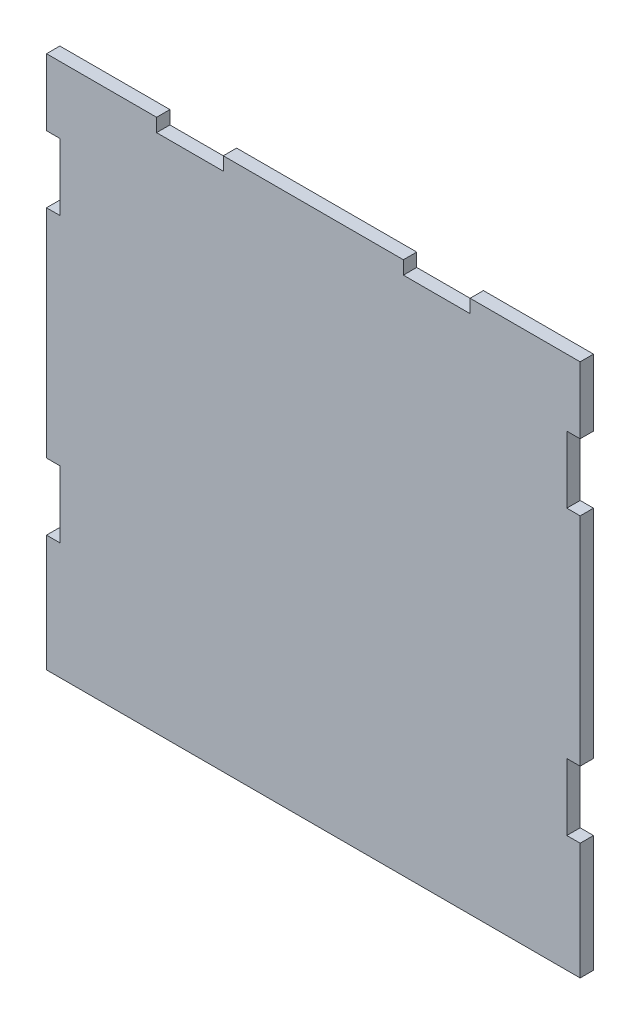
ISO-10303-21;
HEADER;
FILE_DESCRIPTION(('STEP AP214'),'2;1');
FILE_NAME('part.step','',(''),(''),'','','');
FILE_SCHEMA(('AUTOMOTIVE_DESIGN { 1 0 10303 214 1 1 1 1 }'));
ENDSEC;
DATA;
#1=APPLICATION_CONTEXT('core data for automotive mechanical design processes');
#2=APPLICATION_PROTOCOL_DEFINITION('international standard','automotive_design',2000,#1);
#3=PRODUCT_CONTEXT('',#1,'mechanical');
#4=PRODUCT('Part','Part','',(#3));
#5=PRODUCT_RELATED_PRODUCT_CATEGORY('part','',(#4));
#6=PRODUCT_DEFINITION_FORMATION('','',#4);
#7=PRODUCT_DEFINITION_CONTEXT('part definition',#1,'design');
#8=PRODUCT_DEFINITION('design','',#6,#7);
#9=PRODUCT_DEFINITION_SHAPE('','',#8);
#10=(LENGTH_UNIT() NAMED_UNIT(*) SI_UNIT(.MILLI.,.METRE.));
#11=(NAMED_UNIT(*) PLANE_ANGLE_UNIT() SI_UNIT($,.RADIAN.));
#12=(NAMED_UNIT(*) SI_UNIT($,.STERADIAN.) SOLID_ANGLE_UNIT());
#13=UNCERTAINTY_MEASURE_WITH_UNIT(LENGTH_MEASURE(1.E-05),#10,'distance_accuracy_value','');
#14=(GEOMETRIC_REPRESENTATION_CONTEXT(3) GLOBAL_UNCERTAINTY_ASSIGNED_CONTEXT((#13)) GLOBAL_UNIT_ASSIGNED_CONTEXT((#10,
#11,#12)) REPRESENTATION_CONTEXT('',''));
#15=CARTESIAN_POINT('',(0.,0.,0.));
#16=DIRECTION('',(0.,0.,1.));
#17=DIRECTION('',(1.,0.,0.));
#18=AXIS2_PLACEMENT_3D('',#15,#16,#17);
#19=CARTESIAN_POINT('',(101.6,0.,5.08));
#20=DIRECTION('',(1.,0.,0.));
#21=DIRECTION('',(0.,1.,0.));
#22=AXIS2_PLACEMENT_3D('',#19,#20,#21);
#23=PLANE('',#22);
#24=DIRECTION('',(0.,-1.,0.));
#25=VECTOR('',#24,1.);
#26=CARTESIAN_POINT('',(101.6,0.,5.08));
#27=LINE('',#26,#25);
#28=CARTESIAN_POINT('',(101.6,101.6,5.08));
#29=VERTEX_POINT('',#28);
#30=CARTESIAN_POINT('',(101.6,76.2,5.08));
#31=VERTEX_POINT('',#30);
#32=EDGE_CURVE('E379',#29,#31,#27,.T.);
#33=ORIENTED_EDGE('',*,*,#32,.T.);
#34=DIRECTION('',(0.,0.,-1.));
#35=VECTOR('',#34,1.);
#36=CARTESIAN_POINT('',(101.6,76.2,5.08));
#37=LINE('',#36,#35);
#38=CARTESIAN_POINT('',(101.6,76.2,0.));
#39=VERTEX_POINT('',#38);
#40=EDGE_CURVE('E349',#31,#39,#37,.T.);
#41=ORIENTED_EDGE('',*,*,#40,.T.);
#42=DIRECTION('',(0.,-1.,0.));
#43=VECTOR('',#42,1.);
#44=CARTESIAN_POINT('',(101.6,0.,0.));
#45=LINE('',#44,#43);
#46=CARTESIAN_POINT('',(101.6,101.6,0.));
#47=VERTEX_POINT('',#46);
#48=EDGE_CURVE('E398',#47,#39,#45,.T.);
#49=ORIENTED_EDGE('',*,*,#48,.F.);
#50=DIRECTION('',(0.,0.,-1.));
#51=VECTOR('',#50,1.);
#52=CARTESIAN_POINT('',(101.6,101.6,5.08));
#53=LINE('',#52,#51);
#54=EDGE_CURVE('E11',#29,#47,#53,.T.);
#55=ORIENTED_EDGE('',*,*,#54,.F.);
#56=EDGE_LOOP('',(#33,#41,#49,#55));
#57=FACE_BOUND('',#56,.T.);
#58=ADVANCED_FACE('F33',(#57),#23,.T.);
#59=DIRECTION('',(0.,0.,-1.));
#60=VECTOR('',#59,1.);
#61=CARTESIAN_POINT('',(101.6,50.8,5.08));
#62=LINE('',#61,#60);
#63=CARTESIAN_POINT('',(101.6,50.8,5.08));
#64=VERTEX_POINT('',#63);
#65=CARTESIAN_POINT('',(101.6,50.8,0.));
#66=VERTEX_POINT('',#65);
#67=EDGE_CURVE('E347',#64,#66,#62,.T.);
#68=ORIENTED_EDGE('',*,*,#67,.F.);
#69=CARTESIAN_POINT('',(101.6,-31.75,5.08));
#70=VERTEX_POINT('',#69);
#71=EDGE_CURVE('E383',#64,#70,#27,.T.);
#72=ORIENTED_EDGE('',*,*,#71,.T.);
#73=DIRECTION('',(0.,0.,-1.));
#74=VECTOR('',#73,1.);
#75=CARTESIAN_POINT('',(101.6,-31.75,5.08));
#76=LINE('',#75,#74);
#77=CARTESIAN_POINT('',(101.6,-31.75,0.));
#78=VERTEX_POINT('',#77);
#79=EDGE_CURVE('E374',#70,#78,#76,.T.);
#80=ORIENTED_EDGE('',*,*,#79,.T.);
#81=EDGE_CURVE('E402',#66,#78,#45,.T.);
#82=ORIENTED_EDGE('',*,*,#81,.F.);
#83=EDGE_LOOP('',(#68,#72,#80,#82));
#84=FACE_BOUND('',#83,.T.);
#85=ADVANCED_FACE('F474',(#84),#23,.T.);
#86=CARTESIAN_POINT('',(0.,101.6,5.08));
#87=DIRECTION('',(0.,1.,0.));
#88=DIRECTION('',(0.,0.,1.));
#89=AXIS2_PLACEMENT_3D('',#86,#87,#88);
#90=PLANE('',#89);
#91=DIRECTION('',(1.,0.,0.));
#92=VECTOR('',#91,1.);
#93=CARTESIAN_POINT('',(0.,101.6,5.08));
#94=LINE('',#93,#92);
#95=CARTESIAN_POINT('',(-34.29,101.6,5.08));
#96=VERTEX_POINT('',#95);
#97=CARTESIAN_POINT('',(34.29,101.6,5.08));
#98=VERTEX_POINT('',#97);
#99=EDGE_CURVE('E389',#96,#98,#94,.T.);
#100=ORIENTED_EDGE('',*,*,#99,.T.);
#101=DIRECTION('',(0.,0.,-1.));
#102=VECTOR('',#101,1.);
#103=CARTESIAN_POINT('',(34.29,101.6,5.08));
#104=LINE('',#103,#102);
#105=CARTESIAN_POINT('',(34.29,101.6,0.));
#106=VERTEX_POINT('',#105);
#107=EDGE_CURVE('E295',#98,#106,#104,.T.);
#108=ORIENTED_EDGE('',*,*,#107,.T.);
#109=DIRECTION('',(1.,0.,0.));
#110=VECTOR('',#109,1.);
#111=CARTESIAN_POINT('',(0.,101.6,0.));
#112=LINE('',#111,#110);
#113=CARTESIAN_POINT('',(-34.29,101.6,0.));
#114=VERTEX_POINT('',#113);
#115=EDGE_CURVE('E407',#114,#106,#112,.T.);
#116=ORIENTED_EDGE('',*,*,#115,.F.);
#117=DIRECTION('',(0.,0.,-1.));
#118=VECTOR('',#117,1.);
#119=CARTESIAN_POINT('',(-34.29,101.6,5.08));
#120=LINE('',#119,#118);
#121=EDGE_CURVE('E290',#96,#114,#120,.T.);
#122=ORIENTED_EDGE('',*,*,#121,.F.);
#123=EDGE_LOOP('',(#100,#108,#116,#122));
#124=FACE_BOUND('',#123,.T.);
#125=ADVANCED_FACE('F449',(#124),#90,.T.);
#126=CARTESIAN_POINT('',(-101.6,101.6,5.08));
#127=VERTEX_POINT('',#126);
#128=CARTESIAN_POINT('',(-59.69,101.6,5.08));
#129=VERTEX_POINT('',#128);
#130=EDGE_CURVE('E385',#127,#129,#94,.T.);
#131=ORIENTED_EDGE('',*,*,#130,.T.);
#132=DIRECTION('',(0.,0.,-1.));
#133=VECTOR('',#132,1.);
#134=CARTESIAN_POINT('',(-59.69,101.6,5.08));
#135=LINE('',#134,#133);
#136=CARTESIAN_POINT('',(-59.69,101.6,0.));
#137=VERTEX_POINT('',#136);
#138=EDGE_CURVE('E270',#129,#137,#135,.T.);
#139=ORIENTED_EDGE('',*,*,#138,.T.);
#140=CARTESIAN_POINT('',(-101.6,101.6,0.));
#141=VERTEX_POINT('',#140);
#142=EDGE_CURVE('E403',#141,#137,#112,.T.);
#143=ORIENTED_EDGE('',*,*,#142,.F.);
#144=DIRECTION('',(0.,0.,-1.));
#145=VECTOR('',#144,1.);
#146=CARTESIAN_POINT('',(-101.6,101.6,5.08));
#147=LINE('',#146,#145);
#148=EDGE_CURVE('E41',#127,#141,#147,.T.);
#149=ORIENTED_EDGE('',*,*,#148,.F.);
#150=EDGE_LOOP('',(#131,#139,#143,#149));
#151=FACE_BOUND('',#150,.T.);
#152=ADVANCED_FACE('F430',(#151),#90,.T.);
#153=CARTESIAN_POINT('',(-101.6,0.,5.08));
#154=DIRECTION('',(1.,0.,0.));
#155=DIRECTION('',(0.,1.,0.));
#156=AXIS2_PLACEMENT_3D('',#153,#154,#155);
#157=PLANE('',#156);
#158=DIRECTION('',(0.,0.,-1.));
#159=VECTOR('',#158,1.);
#160=CARTESIAN_POINT('',(-101.6,50.8,5.08));
#161=LINE('',#160,#159);
#162=CARTESIAN_POINT('',(-101.6,50.8,5.08));
#163=VERTEX_POINT('',#162);
#164=CARTESIAN_POINT('',(-101.6,50.8,0.));
#165=VERTEX_POINT('',#164);
#166=EDGE_CURVE('E278',#163,#165,#161,.T.);
#167=ORIENTED_EDGE('',*,*,#166,.T.);
#168=DIRECTION('',(0.,-1.,0.));
#169=VECTOR('',#168,1.);
#170=CARTESIAN_POINT('',(-101.6,0.,0.));
#171=LINE('',#170,#169);
#172=CARTESIAN_POINT('',(-101.6,-31.75,0.));
#173=VERTEX_POINT('',#172);
#174=EDGE_CURVE('E412',#165,#173,#171,.T.);
#175=ORIENTED_EDGE('',*,*,#174,.T.);
#176=DIRECTION('',(0.,0.,-1.));
#177=VECTOR('',#176,1.);
#178=CARTESIAN_POINT('',(-101.6,-31.75,5.08));
#179=LINE('',#178,#177);
#180=CARTESIAN_POINT('',(-101.6,-31.75,5.08));
#181=VERTEX_POINT('',#180);
#182=EDGE_CURVE('E256',#181,#173,#179,.T.);
#183=ORIENTED_EDGE('',*,*,#182,.F.);
#184=DIRECTION('',(0.,-1.,0.));
#185=VECTOR('',#184,1.);
#186=CARTESIAN_POINT('',(-101.6,0.,5.08));
#187=LINE('',#186,#185);
#188=EDGE_CURVE('E394',#163,#181,#187,.T.);
#189=ORIENTED_EDGE('',*,*,#188,.F.);
#190=EDGE_LOOP('',(#167,#175,#183,#189));
#191=FACE_BOUND('',#190,.T.);
#192=ADVANCED_FACE('F494',(#191),#157,.F.);
#193=DIRECTION('',(0.,0.,-1.));
#194=VECTOR('',#193,1.);
#195=CARTESIAN_POINT('',(-101.6,-57.15,5.08));
#196=LINE('',#195,#194);
#197=CARTESIAN_POINT('',(-101.6,-57.15,5.08));
#198=VERTEX_POINT('',#197);
#199=CARTESIAN_POINT('',(-101.6,-57.15,0.));
#200=VERTEX_POINT('',#199);
#201=EDGE_CURVE('E226',#198,#200,#196,.T.);
#202=ORIENTED_EDGE('',*,*,#201,.T.);
#203=CARTESIAN_POINT('',(-101.6,-101.6,0.));
#204=VERTEX_POINT('',#203);
#205=EDGE_CURVE('E406',#200,#204,#171,.T.);
#206=ORIENTED_EDGE('',*,*,#205,.T.);
#207=DIRECTION('',(0.,0.,-1.));
#208=VECTOR('',#207,1.);
#209=CARTESIAN_POINT('',(-101.6,-101.6,5.08));
#210=LINE('',#209,#208);
#211=CARTESIAN_POINT('',(-101.6,-101.6,5.08));
#212=VERTEX_POINT('',#211);
#213=EDGE_CURVE('E417',#212,#204,#210,.T.);
#214=ORIENTED_EDGE('',*,*,#213,.F.);
#215=EDGE_CURVE('E388',#198,#212,#187,.T.);
#216=ORIENTED_EDGE('',*,*,#215,.F.);
#217=EDGE_LOOP('',(#202,#206,#214,#216));
#218=FACE_BOUND('',#217,.T.);
#219=ADVANCED_FACE('F489',(#218),#157,.F.);
#220=CARTESIAN_POINT('',(0.,0.,5.08));
#221=DIRECTION('',(0.,0.,1.));
#222=DIRECTION('',(1.,0.,0.));
#223=AXIS2_PLACEMENT_3D('',#220,#221,#222);
#224=PLANE('',#223);
#225=DIRECTION('',(-1.,0.,0.));
#226=VECTOR('',#225,1.);
#227=CARTESIAN_POINT('',(0.,50.8,5.08));
#228=LINE('',#227,#226);
#229=CARTESIAN_POINT('',(96.52,50.8,5.08));
#230=VERTEX_POINT('',#229);
#231=EDGE_CURVE('E337',#64,#230,#228,.T.);
#232=ORIENTED_EDGE('',*,*,#231,.T.);
#233=DIRECTION('',(0.,-1.,0.));
#234=VECTOR('',#233,1.);
#235=CARTESIAN_POINT('',(96.52,0.,5.08));
#236=LINE('',#235,#234);
#237=CARTESIAN_POINT('',(96.52,76.2,5.08));
#238=VERTEX_POINT('',#237);
#239=EDGE_CURVE('E332',#238,#230,#236,.T.);
#240=ORIENTED_EDGE('',*,*,#239,.F.);
#241=DIRECTION('',(-1.,0.,0.));
#242=VECTOR('',#241,1.);
#243=CARTESIAN_POINT('',(0.,76.2,5.08));
#244=LINE('',#243,#242);
#245=EDGE_CURVE('E334',#31,#238,#244,.T.);
#246=ORIENTED_EDGE('',*,*,#245,.F.);
#247=ORIENTED_EDGE('',*,*,#32,.F.);
#248=CARTESIAN_POINT('',(59.69,101.6,5.08));
#249=VERTEX_POINT('',#248);
#250=EDGE_CURVE('E382',#249,#29,#94,.T.);
#251=ORIENTED_EDGE('',*,*,#250,.F.);
#252=DIRECTION('',(0.,-1.,0.));
#253=VECTOR('',#252,1.);
#254=CARTESIAN_POINT('',(59.69,0.,5.08));
#255=LINE('',#254,#253);
#256=CARTESIAN_POINT('',(59.69,96.52,5.08));
#257=VERTEX_POINT('',#256);
#258=EDGE_CURVE('E307',#249,#257,#255,.T.);
#259=ORIENTED_EDGE('',*,*,#258,.T.);
#260=DIRECTION('',(1.,0.,0.));
#261=VECTOR('',#260,1.);
#262=CARTESIAN_POINT('',(0.,96.52,5.08));
#263=LINE('',#262,#261);
#264=CARTESIAN_POINT('',(34.29,96.52,5.08));
#265=VERTEX_POINT('',#264);
#266=EDGE_CURVE('E310',#265,#257,#263,.T.);
#267=ORIENTED_EDGE('',*,*,#266,.F.);
#268=DIRECTION('',(0.,-1.,0.));
#269=VECTOR('',#268,1.);
#270=CARTESIAN_POINT('',(34.2899999999997,0.,5.08));
#271=LINE('',#270,#269);
#272=EDGE_CURVE('E313',#98,#265,#271,.T.);
#273=ORIENTED_EDGE('',*,*,#272,.F.);
#274=ORIENTED_EDGE('',*,*,#99,.F.);
#275=DIRECTION('',(0.,-1.,0.));
#276=VECTOR('',#275,1.);
#277=CARTESIAN_POINT('',(-34.29,0.,5.08));
#278=LINE('',#277,#276);
#279=CARTESIAN_POINT('',(-34.29,96.52,5.08));
#280=VERTEX_POINT('',#279);
#281=EDGE_CURVE('E282',#96,#280,#278,.T.);
#282=ORIENTED_EDGE('',*,*,#281,.T.);
#283=DIRECTION('',(1.,0.,0.));
#284=VECTOR('',#283,1.);
#285=CARTESIAN_POINT('',(0.,96.52,5.08));
#286=LINE('',#285,#284);
#287=CARTESIAN_POINT('',(-59.69,96.52,5.08));
#288=VERTEX_POINT('',#287);
#289=EDGE_CURVE('E285',#288,#280,#286,.T.);
#290=ORIENTED_EDGE('',*,*,#289,.F.);
#291=DIRECTION('',(0.,-1.,0.));
#292=VECTOR('',#291,1.);
#293=CARTESIAN_POINT('',(-59.69,0.,5.08));
#294=LINE('',#293,#292);
#295=EDGE_CURVE('E288',#129,#288,#294,.T.);
#296=ORIENTED_EDGE('',*,*,#295,.F.);
#297=ORIENTED_EDGE('',*,*,#130,.F.);
#298=CARTESIAN_POINT('',(-101.6,76.2,5.08));
#299=VERTEX_POINT('',#298);
#300=EDGE_CURVE('E390',#127,#299,#187,.T.);
#301=ORIENTED_EDGE('',*,*,#300,.T.);
#302=DIRECTION('',(1.,0.,0.));
#303=VECTOR('',#302,1.);
#304=CARTESIAN_POINT('',(0.,76.2,5.08));
#305=LINE('',#304,#303);
#306=CARTESIAN_POINT('',(-96.52,76.2,5.08));
#307=VERTEX_POINT('',#306);
#308=EDGE_CURVE('E264',#299,#307,#305,.T.);
#309=ORIENTED_EDGE('',*,*,#308,.T.);
#310=DIRECTION('',(0.,1.,0.));
#311=VECTOR('',#310,1.);
#312=CARTESIAN_POINT('',(-96.52,0.,5.08));
#313=LINE('',#312,#311);
#314=CARTESIAN_POINT('',(-96.52,50.8,5.08));
#315=VERTEX_POINT('',#314);
#316=EDGE_CURVE('E259',#315,#307,#313,.T.);
#317=ORIENTED_EDGE('',*,*,#316,.F.);
#318=DIRECTION('',(1.,0.,0.));
#319=VECTOR('',#318,1.);
#320=CARTESIAN_POINT('',(0.,50.8,5.08));
#321=LINE('',#320,#319);
#322=EDGE_CURVE('E261',#163,#315,#321,.T.);
#323=ORIENTED_EDGE('',*,*,#322,.F.);
#324=ORIENTED_EDGE('',*,*,#188,.T.);
#325=DIRECTION('',(1.,0.,0.));
#326=VECTOR('',#325,1.);
#327=CARTESIAN_POINT('',(0.,-31.75,5.08));
#328=LINE('',#327,#326);
#329=CARTESIAN_POINT('',(-96.52,-31.75,5.08));
#330=VERTEX_POINT('',#329);
#331=EDGE_CURVE('E230',#181,#330,#328,.T.);
#332=ORIENTED_EDGE('',*,*,#331,.T.);
#333=DIRECTION('',(0.,1.,0.));
#334=VECTOR('',#333,1.);
#335=CARTESIAN_POINT('',(-96.52,0.,5.08));
#336=LINE('',#335,#334);
#337=CARTESIAN_POINT('',(-96.52,-57.15,5.08));
#338=VERTEX_POINT('',#337);
#339=EDGE_CURVE('E231',#338,#330,#336,.T.);
#340=ORIENTED_EDGE('',*,*,#339,.F.);
#341=DIRECTION('',(1.,0.,0.));
#342=VECTOR('',#341,1.);
#343=CARTESIAN_POINT('',(0.,-57.1500000000001,5.08));
#344=LINE('',#343,#342);
#345=EDGE_CURVE('E220',#198,#338,#344,.T.);
#346=ORIENTED_EDGE('',*,*,#345,.F.);
#347=ORIENTED_EDGE('',*,*,#215,.T.);
#348=DIRECTION('',(1.,0.,0.));
#349=VECTOR('',#348,1.);
#350=CARTESIAN_POINT('',(0.,-101.6,5.08));
#351=LINE('',#350,#349);
#352=CARTESIAN_POINT('',(101.6,-101.6,5.08));
#353=VERTEX_POINT('',#352);
#354=EDGE_CURVE('E393',#212,#353,#351,.T.);
#355=ORIENTED_EDGE('',*,*,#354,.T.);
#356=CARTESIAN_POINT('',(101.6,-57.15,5.08));
#357=VERTEX_POINT('',#356);
#358=EDGE_CURVE('E384',#357,#353,#27,.T.);
#359=ORIENTED_EDGE('',*,*,#358,.F.);
#360=DIRECTION('',(-1.,0.,0.));
#361=VECTOR('',#360,1.);
#362=CARTESIAN_POINT('',(0.,-57.15,5.08));
#363=LINE('',#362,#361);
#364=CARTESIAN_POINT('',(96.52,-57.15,5.08));
#365=VERTEX_POINT('',#364);
#366=EDGE_CURVE('E358',#357,#365,#363,.T.);
#367=ORIENTED_EDGE('',*,*,#366,.T.);
#368=DIRECTION('',(0.,-1.,0.));
#369=VECTOR('',#368,1.);
#370=CARTESIAN_POINT('',(96.52,0.,5.08));
#371=LINE('',#370,#369);
#372=CARTESIAN_POINT('',(96.52,-31.75,5.08));
#373=VERTEX_POINT('',#372);
#374=EDGE_CURVE('E353',#373,#365,#371,.T.);
#375=ORIENTED_EDGE('',*,*,#374,.F.);
#376=DIRECTION('',(-1.,0.,0.));
#377=VECTOR('',#376,1.);
#378=CARTESIAN_POINT('',(0.,-31.75,5.08));
#379=LINE('',#378,#377);
#380=EDGE_CURVE('E355',#70,#373,#379,.T.);
#381=ORIENTED_EDGE('',*,*,#380,.F.);
#382=ORIENTED_EDGE('',*,*,#71,.F.);
#383=EDGE_LOOP('',(#232,#240,#246,#247,#251,#259,#267,#273,#274,#282,#290,#296,#297,#301,#309,
#317,#323,#324,#332,#340,#346,#347,#355,#359,#367,#375,#381,#382));
#384=FACE_BOUND('',#383,.T.);
#385=ADVANCED_FACE('F241',(#384),#224,.T.);
#386=CARTESIAN_POINT('',(0.,0.,0.));
#387=DIRECTION('',(0.,0.,1.));
#388=DIRECTION('',(1.,0.,0.));
#389=AXIS2_PLACEMENT_3D('',#386,#387,#388);
#390=PLANE('',#389);
#391=DIRECTION('',(0.,-1.,0.));
#392=VECTOR('',#391,1.);
#393=CARTESIAN_POINT('',(96.52,0.,0.));
#394=LINE('',#393,#392);
#395=CARTESIAN_POINT('',(96.52,76.2,0.));
#396=VERTEX_POINT('',#395);
#397=CARTESIAN_POINT('',(96.52,50.8,0.));
#398=VERTEX_POINT('',#397);
#399=EDGE_CURVE('E48',#396,#398,#394,.T.);
#400=ORIENTED_EDGE('',*,*,#399,.T.);
#401=DIRECTION('',(-1.,0.,0.));
#402=VECTOR('',#401,1.);
#403=CARTESIAN_POINT('',(0.,50.8,0.));
#404=LINE('',#403,#402);
#405=EDGE_CURVE('E335',#66,#398,#404,.T.);
#406=ORIENTED_EDGE('',*,*,#405,.F.);
#407=ORIENTED_EDGE('',*,*,#81,.T.);
#408=DIRECTION('',(-1.,0.,0.));
#409=VECTOR('',#408,1.);
#410=CARTESIAN_POINT('',(0.,-31.75,0.));
#411=LINE('',#410,#409);
#412=CARTESIAN_POINT('',(96.52,-31.75,0.));
#413=VERTEX_POINT('',#412);
#414=EDGE_CURVE('E364',#78,#413,#411,.T.);
#415=ORIENTED_EDGE('',*,*,#414,.T.);
#416=DIRECTION('',(0.,-1.,0.));
#417=VECTOR('',#416,1.);
#418=CARTESIAN_POINT('',(96.52,0.,0.));
#419=LINE('',#418,#417);
#420=CARTESIAN_POINT('',(96.52,-57.15,0.));
#421=VERTEX_POINT('',#420);
#422=EDGE_CURVE('E255',#413,#421,#419,.T.);
#423=ORIENTED_EDGE('',*,*,#422,.T.);
#424=DIRECTION('',(-1.,0.,0.));
#425=VECTOR('',#424,1.);
#426=CARTESIAN_POINT('',(0.,-57.15,0.));
#427=LINE('',#426,#425);
#428=CARTESIAN_POINT('',(101.6,-57.15,0.));
#429=VERTEX_POINT('',#428);
#430=EDGE_CURVE('E356',#429,#421,#427,.T.);
#431=ORIENTED_EDGE('',*,*,#430,.F.);
#432=CARTESIAN_POINT('',(101.6,-101.6,0.));
#433=VERTEX_POINT('',#432);
#434=EDGE_CURVE('E371',#429,#433,#45,.T.);
#435=ORIENTED_EDGE('',*,*,#434,.T.);
#436=DIRECTION('',(1.,0.,0.));
#437=VECTOR('',#436,1.);
#438=CARTESIAN_POINT('',(0.,-101.6,0.));
#439=LINE('',#438,#437);
#440=EDGE_CURVE('E411',#204,#433,#439,.T.);
#441=ORIENTED_EDGE('',*,*,#440,.F.);
#442=ORIENTED_EDGE('',*,*,#205,.F.);
#443=DIRECTION('',(1.,0.,0.));
#444=VECTOR('',#443,1.);
#445=CARTESIAN_POINT('',(0.,-57.1500000000001,0.));
#446=LINE('',#445,#444);
#447=CARTESIAN_POINT('',(-96.52,-57.15,0.));
#448=VERTEX_POINT('',#447);
#449=EDGE_CURVE('E246',#200,#448,#446,.T.);
#450=ORIENTED_EDGE('',*,*,#449,.T.);
#451=DIRECTION('',(0.,1.,0.));
#452=VECTOR('',#451,1.);
#453=CARTESIAN_POINT('',(-96.52,0.,0.));
#454=LINE('',#453,#452);
#455=CARTESIAN_POINT('',(-96.52,-31.75,0.));
#456=VERTEX_POINT('',#455);
#457=EDGE_CURVE('E237',#448,#456,#454,.T.);
#458=ORIENTED_EDGE('',*,*,#457,.T.);
#459=DIRECTION('',(1.,0.,0.));
#460=VECTOR('',#459,1.);
#461=CARTESIAN_POINT('',(0.,-31.75,0.));
#462=LINE('',#461,#460);
#463=EDGE_CURVE('E243',#173,#456,#462,.T.);
#464=ORIENTED_EDGE('',*,*,#463,.F.);
#465=ORIENTED_EDGE('',*,*,#174,.F.);
#466=DIRECTION('',(1.,0.,0.));
#467=VECTOR('',#466,1.);
#468=CARTESIAN_POINT('',(0.,50.8,0.));
#469=LINE('',#468,#467);
#470=CARTESIAN_POINT('',(-96.52,50.8,0.));
#471=VERTEX_POINT('',#470);
#472=EDGE_CURVE('E269',#165,#471,#469,.T.);
#473=ORIENTED_EDGE('',*,*,#472,.T.);
#474=DIRECTION('',(0.,1.,0.));
#475=VECTOR('',#474,1.);
#476=CARTESIAN_POINT('',(-96.52,0.,0.));
#477=LINE('',#476,#475);
#478=CARTESIAN_POINT('',(-96.52,76.2,0.));
#479=VERTEX_POINT('',#478);
#480=EDGE_CURVE('E56',#471,#479,#477,.T.);
#481=ORIENTED_EDGE('',*,*,#480,.T.);
#482=DIRECTION('',(1.,0.,0.));
#483=VECTOR('',#482,1.);
#484=CARTESIAN_POINT('',(0.,76.2,0.));
#485=LINE('',#484,#483);
#486=CARTESIAN_POINT('',(-101.6,76.2,0.));
#487=VERTEX_POINT('',#486);
#488=EDGE_CURVE('E262',#487,#479,#485,.T.);
#489=ORIENTED_EDGE('',*,*,#488,.F.);
#490=EDGE_CURVE('E408',#141,#487,#171,.T.);
#491=ORIENTED_EDGE('',*,*,#490,.F.);
#492=ORIENTED_EDGE('',*,*,#142,.T.);
#493=DIRECTION('',(0.,-1.,0.));
#494=VECTOR('',#493,1.);
#495=CARTESIAN_POINT('',(-59.69,0.,0.));
#496=LINE('',#495,#494);
#497=CARTESIAN_POINT('',(-59.69,96.52,0.));
#498=VERTEX_POINT('',#497);
#499=EDGE_CURVE('E286',#137,#498,#496,.T.);
#500=ORIENTED_EDGE('',*,*,#499,.T.);
#501=DIRECTION('',(1.,0.,0.));
#502=VECTOR('',#501,1.);
#503=CARTESIAN_POINT('',(0.,96.52,0.));
#504=LINE('',#503,#502);
#505=CARTESIAN_POINT('',(-34.29,96.52,0.));
#506=VERTEX_POINT('',#505);
#507=EDGE_CURVE('E294',#498,#506,#504,.T.);
#508=ORIENTED_EDGE('',*,*,#507,.T.);
#509=DIRECTION('',(0.,-1.,0.));
#510=VECTOR('',#509,1.);
#511=CARTESIAN_POINT('',(-34.29,0.,0.));
#512=LINE('',#511,#510);
#513=EDGE_CURVE('E291',#114,#506,#512,.T.);
#514=ORIENTED_EDGE('',*,*,#513,.F.);
#515=ORIENTED_EDGE('',*,*,#115,.T.);
#516=DIRECTION('',(0.,-1.,0.));
#517=VECTOR('',#516,1.);
#518=CARTESIAN_POINT('',(34.2899999999997,0.,0.));
#519=LINE('',#518,#517);
#520=CARTESIAN_POINT('',(34.29,96.52,0.));
#521=VERTEX_POINT('',#520);
#522=EDGE_CURVE('E311',#106,#521,#519,.T.);
#523=ORIENTED_EDGE('',*,*,#522,.T.);
#524=DIRECTION('',(1.,0.,0.));
#525=VECTOR('',#524,1.);
#526=CARTESIAN_POINT('',(0.,96.52,0.));
#527=LINE('',#526,#525);
#528=CARTESIAN_POINT('',(59.69,96.52,0.));
#529=VERTEX_POINT('',#528);
#530=EDGE_CURVE('E319',#521,#529,#527,.T.);
#531=ORIENTED_EDGE('',*,*,#530,.T.);
#532=DIRECTION('',(0.,-1.,0.));
#533=VECTOR('',#532,1.);
#534=CARTESIAN_POINT('',(59.69,0.,0.));
#535=LINE('',#534,#533);
#536=CARTESIAN_POINT('',(59.69,101.6,0.));
#537=VERTEX_POINT('',#536);
#538=EDGE_CURVE('E316',#537,#529,#535,.T.);
#539=ORIENTED_EDGE('',*,*,#538,.F.);
#540=EDGE_CURVE('E401',#537,#47,#112,.T.);
#541=ORIENTED_EDGE('',*,*,#540,.T.);
#542=ORIENTED_EDGE('',*,*,#48,.T.);
#543=DIRECTION('',(-1.,0.,0.));
#544=VECTOR('',#543,1.);
#545=CARTESIAN_POINT('',(0.,76.2,0.));
#546=LINE('',#545,#544);
#547=EDGE_CURVE('E341',#39,#396,#546,.T.);
#548=ORIENTED_EDGE('',*,*,#547,.T.);
#549=EDGE_LOOP('',(#400,#406,#407,#415,#423,#431,#435,#441,#442,#450,#458,#464,#465,#473,#481,
#489,#491,#492,#500,#508,#514,#515,#523,#531,#539,#541,#542,#548));
#550=FACE_BOUND('',#549,.T.);
#551=ADVANCED_FACE('F429',(#550),#390,.F.);
#552=DIRECTION('',(0.,0.,-1.));
#553=VECTOR('',#552,1.);
#554=CARTESIAN_POINT('',(101.6,-57.15,5.08));
#555=LINE('',#554,#553);
#556=EDGE_CURVE('E372',#357,#429,#555,.T.);
#557=ORIENTED_EDGE('',*,*,#556,.F.);
#558=ORIENTED_EDGE('',*,*,#358,.T.);
#559=DIRECTION('',(0.,0.,-1.));
#560=VECTOR('',#559,1.);
#561=CARTESIAN_POINT('',(101.6,-101.6,5.08));
#562=LINE('',#561,#560);
#563=EDGE_CURVE('E397',#353,#433,#562,.T.);
#564=ORIENTED_EDGE('',*,*,#563,.T.);
#565=ORIENTED_EDGE('',*,*,#434,.F.);
#566=EDGE_LOOP('',(#557,#558,#564,#565));
#567=FACE_BOUND('',#566,.T.);
#568=ADVANCED_FACE('F35',(#567),#23,.T.);
#569=DIRECTION('',(0.,0.,-1.));
#570=VECTOR('',#569,1.);
#571=CARTESIAN_POINT('',(59.69,101.6,5.08));
#572=LINE('',#571,#570);
#573=EDGE_CURVE('E315',#249,#537,#572,.T.);
#574=ORIENTED_EDGE('',*,*,#573,.F.);
#575=ORIENTED_EDGE('',*,*,#250,.T.);
#576=ORIENTED_EDGE('',*,*,#54,.T.);
#577=ORIENTED_EDGE('',*,*,#540,.F.);
#578=EDGE_LOOP('',(#574,#575,#576,#577));
#579=FACE_BOUND('',#578,.T.);
#580=ADVANCED_FACE('F456',(#579),#90,.T.);
#581=ORIENTED_EDGE('',*,*,#490,.T.);
#582=DIRECTION('',(0.,0.,-1.));
#583=VECTOR('',#582,1.);
#584=CARTESIAN_POINT('',(-101.6,76.2,5.08));
#585=LINE('',#584,#583);
#586=EDGE_CURVE('E276',#299,#487,#585,.T.);
#587=ORIENTED_EDGE('',*,*,#586,.F.);
#588=ORIENTED_EDGE('',*,*,#300,.F.);
#589=ORIENTED_EDGE('',*,*,#148,.T.);
#590=EDGE_LOOP('',(#581,#587,#588,#589));
#591=FACE_BOUND('',#590,.T.);
#592=ADVANCED_FACE('F422',(#591),#157,.F.);
#593=CARTESIAN_POINT('',(0.,-101.6,5.08));
#594=DIRECTION('',(0.,1.,0.));
#595=DIRECTION('',(0.,0.,1.));
#596=AXIS2_PLACEMENT_3D('',#593,#594,#595);
#597=PLANE('',#596);
#598=ORIENTED_EDGE('',*,*,#440,.T.);
#599=ORIENTED_EDGE('',*,*,#563,.F.);
#600=ORIENTED_EDGE('',*,*,#354,.F.);
#601=ORIENTED_EDGE('',*,*,#213,.T.);
#602=EDGE_LOOP('',(#598,#599,#600,#601));
#603=FACE_BOUND('',#602,.T.);
#604=ADVANCED_FACE('F486',(#603),#597,.F.);
#605=CARTESIAN_POINT('',(96.52,0.,5.08));
#606=DIRECTION('',(1.,0.,0.));
#607=DIRECTION('',(0.,1.,0.));
#608=AXIS2_PLACEMENT_3D('',#605,#606,#607);
#609=PLANE('',#608);
#610=ORIENTED_EDGE('',*,*,#422,.F.);
#611=DIRECTION('',(0.,0.,-1.));
#612=VECTOR('',#611,1.);
#613=CARTESIAN_POINT('',(96.52,-31.75,5.08));
#614=LINE('',#613,#612);
#615=EDGE_CURVE('E361',#373,#413,#614,.T.);
#616=ORIENTED_EDGE('',*,*,#615,.F.);
#617=ORIENTED_EDGE('',*,*,#374,.T.);
#618=DIRECTION('',(0.,0.,-1.));
#619=VECTOR('',#618,1.);
#620=CARTESIAN_POINT('',(96.52,-57.15,5.08));
#621=LINE('',#620,#619);
#622=EDGE_CURVE('E369',#365,#421,#621,.T.);
#623=ORIENTED_EDGE('',*,*,#622,.T.);
#624=EDGE_LOOP('',(#610,#616,#617,#623));
#625=FACE_BOUND('',#624,.T.);
#626=ADVANCED_FACE('F528',(#625),#609,.T.);
#627=CARTESIAN_POINT('',(0.,-57.15,5.08));
#628=DIRECTION('',(0.,-1.,0.));
#629=DIRECTION('',(0.,0.,-1.));
#630=AXIS2_PLACEMENT_3D('',#627,#628,#629);
#631=PLANE('',#630);
#632=ORIENTED_EDGE('',*,*,#430,.T.);
#633=ORIENTED_EDGE('',*,*,#622,.F.);
#634=ORIENTED_EDGE('',*,*,#366,.F.);
#635=ORIENTED_EDGE('',*,*,#556,.T.);
#636=EDGE_LOOP('',(#632,#633,#634,#635));
#637=FACE_BOUND('',#636,.T.);
#638=ADVANCED_FACE('F583',(#637),#631,.F.);
#639=CARTESIAN_POINT('',(0.,-31.75,5.08));
#640=DIRECTION('',(0.,-1.,0.));
#641=DIRECTION('',(0.,0.,-1.));
#642=AXIS2_PLACEMENT_3D('',#639,#640,#641);
#643=PLANE('',#642);
#644=ORIENTED_EDGE('',*,*,#414,.F.);
#645=ORIENTED_EDGE('',*,*,#79,.F.);
#646=ORIENTED_EDGE('',*,*,#380,.T.);
#647=ORIENTED_EDGE('',*,*,#615,.T.);
#648=EDGE_LOOP('',(#644,#645,#646,#647));
#649=FACE_BOUND('',#648,.T.);
#650=ADVANCED_FACE('F507',(#649),#643,.T.);
#651=CARTESIAN_POINT('',(-96.52,0.,5.08));
#652=DIRECTION('',(-1.,0.,0.));
#653=DIRECTION('',(0.,0.,1.));
#654=AXIS2_PLACEMENT_3D('',#651,#652,#653);
#655=PLANE('',#654);
#656=ORIENTED_EDGE('',*,*,#457,.F.);
#657=DIRECTION('',(0.,0.,-1.));
#658=VECTOR('',#657,1.);
#659=CARTESIAN_POINT('',(-96.52,-57.15,5.08));
#660=LINE('',#659,#658);
#661=EDGE_CURVE('E223',#338,#448,#660,.T.);
#662=ORIENTED_EDGE('',*,*,#661,.F.);
#663=ORIENTED_EDGE('',*,*,#339,.T.);
#664=DIRECTION('',(0.,0.,-1.));
#665=VECTOR('',#664,1.);
#666=CARTESIAN_POINT('',(-96.52,-31.75,5.08));
#667=LINE('',#666,#665);
#668=EDGE_CURVE('E253',#330,#456,#667,.T.);
#669=ORIENTED_EDGE('',*,*,#668,.T.);
#670=EDGE_LOOP('',(#656,#662,#663,#669));
#671=FACE_BOUND('',#670,.T.);
#672=ADVANCED_FACE('F234',(#671),#655,.T.);
#673=CARTESIAN_POINT('',(0.,-31.75,5.08));
#674=DIRECTION('',(0.,1.,0.));
#675=DIRECTION('',(0.,0.,1.));
#676=AXIS2_PLACEMENT_3D('',#673,#674,#675);
#677=PLANE('',#676);
#678=ORIENTED_EDGE('',*,*,#463,.T.);
#679=ORIENTED_EDGE('',*,*,#668,.F.);
#680=ORIENTED_EDGE('',*,*,#331,.F.);
#681=ORIENTED_EDGE('',*,*,#182,.T.);
#682=EDGE_LOOP('',(#678,#679,#680,#681));
#683=FACE_BOUND('',#682,.T.);
#684=ADVANCED_FACE('F498',(#683),#677,.F.);
#685=CARTESIAN_POINT('',(0.,-57.1500000000001,5.08));
#686=DIRECTION('',(0.,1.,0.));
#687=DIRECTION('',(-1.,0.,0.));
#688=AXIS2_PLACEMENT_3D('',#685,#686,#687);
#689=PLANE('',#688);
#690=ORIENTED_EDGE('',*,*,#449,.F.);
#691=ORIENTED_EDGE('',*,*,#201,.F.);
#692=ORIENTED_EDGE('',*,*,#345,.T.);
#693=ORIENTED_EDGE('',*,*,#661,.T.);
#694=EDGE_LOOP('',(#690,#691,#692,#693));
#695=FACE_BOUND('',#694,.T.);
#696=ADVANCED_FACE('F222',(#695),#689,.T.);
#697=CARTESIAN_POINT('',(-96.52,0.,5.08));
#698=DIRECTION('',(-1.,0.,0.));
#699=DIRECTION('',(0.,0.,1.));
#700=AXIS2_PLACEMENT_3D('',#697,#698,#699);
#701=PLANE('',#700);
#702=ORIENTED_EDGE('',*,*,#480,.F.);
#703=DIRECTION('',(0.,0.,-1.));
#704=VECTOR('',#703,1.);
#705=CARTESIAN_POINT('',(-96.52,50.8,5.08));
#706=LINE('',#705,#704);
#707=EDGE_CURVE('E267',#315,#471,#706,.T.);
#708=ORIENTED_EDGE('',*,*,#707,.F.);
#709=ORIENTED_EDGE('',*,*,#316,.T.);
#710=DIRECTION('',(0.,0.,-1.));
#711=VECTOR('',#710,1.);
#712=CARTESIAN_POINT('',(-96.52,76.2,5.08));
#713=LINE('',#712,#711);
#714=EDGE_CURVE('E251',#307,#479,#713,.T.);
#715=ORIENTED_EDGE('',*,*,#714,.T.);
#716=EDGE_LOOP('',(#702,#708,#709,#715));
#717=FACE_BOUND('',#716,.T.);
#718=ADVANCED_FACE('F505',(#717),#701,.T.);
#719=CARTESIAN_POINT('',(0.,76.2,5.08));
#720=DIRECTION('',(0.,1.,0.));
#721=DIRECTION('',(0.,0.,1.));
#722=AXIS2_PLACEMENT_3D('',#719,#720,#721);
#723=PLANE('',#722);
#724=ORIENTED_EDGE('',*,*,#488,.T.);
#725=ORIENTED_EDGE('',*,*,#714,.F.);
#726=ORIENTED_EDGE('',*,*,#308,.F.);
#727=ORIENTED_EDGE('',*,*,#586,.T.);
#728=EDGE_LOOP('',(#724,#725,#726,#727));
#729=FACE_BOUND('',#728,.T.);
#730=ADVANCED_FACE('F620',(#729),#723,.F.);
#731=CARTESIAN_POINT('',(0.,50.8,5.08));
#732=DIRECTION('',(0.,1.,0.));
#733=DIRECTION('',(0.,0.,1.));
#734=AXIS2_PLACEMENT_3D('',#731,#732,#733);
#735=PLANE('',#734);
#736=ORIENTED_EDGE('',*,*,#472,.F.);
#737=ORIENTED_EDGE('',*,*,#166,.F.);
#738=ORIENTED_EDGE('',*,*,#322,.T.);
#739=ORIENTED_EDGE('',*,*,#707,.T.);
#740=EDGE_LOOP('',(#736,#737,#738,#739));
#741=FACE_BOUND('',#740,.T.);
#742=ADVANCED_FACE('F629',(#741),#735,.T.);
#743=CARTESIAN_POINT('',(-59.69,0.,5.08));
#744=DIRECTION('',(1.,0.,0.));
#745=DIRECTION('',(0.,0.,-1.));
#746=AXIS2_PLACEMENT_3D('',#743,#744,#745);
#747=PLANE('',#746);
#748=ORIENTED_EDGE('',*,*,#499,.F.);
#749=ORIENTED_EDGE('',*,*,#138,.F.);
#750=ORIENTED_EDGE('',*,*,#295,.T.);
#751=DIRECTION('',(0.,0.,-1.));
#752=VECTOR('',#751,1.);
#753=CARTESIAN_POINT('',(-59.69,96.52,5.08));
#754=LINE('',#753,#752);
#755=EDGE_CURVE('E302',#288,#498,#754,.T.);
#756=ORIENTED_EDGE('',*,*,#755,.T.);
#757=EDGE_LOOP('',(#748,#749,#750,#756));
#758=FACE_BOUND('',#757,.T.);
#759=ADVANCED_FACE('F433',(#758),#747,.T.);
#760=CARTESIAN_POINT('',(0.,96.52,5.08));
#761=DIRECTION('',(0.,1.,0.));
#762=DIRECTION('',(0.,0.,1.));
#763=AXIS2_PLACEMENT_3D('',#760,#761,#762);
#764=PLANE('',#763);
#765=ORIENTED_EDGE('',*,*,#507,.F.);
#766=ORIENTED_EDGE('',*,*,#755,.F.);
#767=ORIENTED_EDGE('',*,*,#289,.T.);
#768=DIRECTION('',(0.,0.,-1.));
#769=VECTOR('',#768,1.);
#770=CARTESIAN_POINT('',(-34.29,96.52,5.08));
#771=LINE('',#770,#769);
#772=EDGE_CURVE('E304',#280,#506,#771,.T.);
#773=ORIENTED_EDGE('',*,*,#772,.T.);
#774=EDGE_LOOP('',(#765,#766,#767,#773));
#775=FACE_BOUND('',#774,.T.);
#776=ADVANCED_FACE('F440',(#775),#764,.T.);
#777=CARTESIAN_POINT('',(-34.29,0.,5.08));
#778=DIRECTION('',(1.,0.,0.));
#779=DIRECTION('',(0.,0.,-1.));
#780=AXIS2_PLACEMENT_3D('',#777,#778,#779);
#781=PLANE('',#780);
#782=ORIENTED_EDGE('',*,*,#513,.T.);
#783=ORIENTED_EDGE('',*,*,#772,.F.);
#784=ORIENTED_EDGE('',*,*,#281,.F.);
#785=ORIENTED_EDGE('',*,*,#121,.T.);
#786=EDGE_LOOP('',(#782,#783,#784,#785));
#787=FACE_BOUND('',#786,.T.);
#788=ADVANCED_FACE('F442',(#787),#781,.F.);
#789=CARTESIAN_POINT('',(34.2899999999997,0.,5.08));
#790=DIRECTION('',(1.,0.,0.));
#791=DIRECTION('',(0.,1.,0.));
#792=AXIS2_PLACEMENT_3D('',#789,#790,#791);
#793=PLANE('',#792);
#794=ORIENTED_EDGE('',*,*,#522,.F.);
#795=ORIENTED_EDGE('',*,*,#107,.F.);
#796=ORIENTED_EDGE('',*,*,#272,.T.);
#797=DIRECTION('',(0.,0.,-1.));
#798=VECTOR('',#797,1.);
#799=CARTESIAN_POINT('',(34.29,96.52,5.08));
#800=LINE('',#799,#798);
#801=EDGE_CURVE('E327',#265,#521,#800,.T.);
#802=ORIENTED_EDGE('',*,*,#801,.T.);
#803=EDGE_LOOP('',(#794,#795,#796,#802));
#804=FACE_BOUND('',#803,.T.);
#805=ADVANCED_FACE('F664',(#804),#793,.T.);
#806=CARTESIAN_POINT('',(0.,96.52,5.08));
#807=DIRECTION('',(0.,1.,0.));
#808=DIRECTION('',(-1.,0.,0.));
#809=AXIS2_PLACEMENT_3D('',#806,#807,#808);
#810=PLANE('',#809);
#811=ORIENTED_EDGE('',*,*,#530,.F.);
#812=ORIENTED_EDGE('',*,*,#801,.F.);
#813=ORIENTED_EDGE('',*,*,#266,.T.);
#814=DIRECTION('',(0.,0.,-1.));
#815=VECTOR('',#814,1.);
#816=CARTESIAN_POINT('',(59.69,96.52,5.08));
#817=LINE('',#816,#815);
#818=EDGE_CURVE('E329',#257,#529,#817,.T.);
#819=ORIENTED_EDGE('',*,*,#818,.T.);
#820=EDGE_LOOP('',(#811,#812,#813,#819));
#821=FACE_BOUND('',#820,.T.);
#822=ADVANCED_FACE('F673',(#821),#810,.T.);
#823=CARTESIAN_POINT('',(59.69,0.,5.08));
#824=DIRECTION('',(1.,0.,0.));
#825=DIRECTION('',(0.,0.,-1.));
#826=AXIS2_PLACEMENT_3D('',#823,#824,#825);
#827=PLANE('',#826);
#828=ORIENTED_EDGE('',*,*,#538,.T.);
#829=ORIENTED_EDGE('',*,*,#818,.F.);
#830=ORIENTED_EDGE('',*,*,#258,.F.);
#831=ORIENTED_EDGE('',*,*,#573,.T.);
#832=EDGE_LOOP('',(#828,#829,#830,#831));
#833=FACE_BOUND('',#832,.T.);
#834=ADVANCED_FACE('F683',(#833),#827,.F.);
#835=CARTESIAN_POINT('',(96.52,0.,5.08));
#836=DIRECTION('',(1.,0.,0.));
#837=DIRECTION('',(0.,0.,-1.));
#838=AXIS2_PLACEMENT_3D('',#835,#836,#837);
#839=PLANE('',#838);
#840=ORIENTED_EDGE('',*,*,#399,.F.);
#841=DIRECTION('',(0.,0.,-1.));
#842=VECTOR('',#841,1.);
#843=CARTESIAN_POINT('',(96.52,76.2,5.08));
#844=LINE('',#843,#842);
#845=EDGE_CURVE('E339',#238,#396,#844,.T.);
#846=ORIENTED_EDGE('',*,*,#845,.F.);
#847=ORIENTED_EDGE('',*,*,#239,.T.);
#848=DIRECTION('',(0.,0.,-1.));
#849=VECTOR('',#848,1.);
#850=CARTESIAN_POINT('',(96.52,50.8,5.08));
#851=LINE('',#850,#849);
#852=EDGE_CURVE('E320',#230,#398,#851,.T.);
#853=ORIENTED_EDGE('',*,*,#852,.T.);
#854=EDGE_LOOP('',(#840,#846,#847,#853));
#855=FACE_BOUND('',#854,.T.);
#856=ADVANCED_FACE('F466',(#855),#839,.T.);
#857=CARTESIAN_POINT('',(0.,50.8,5.08));
#858=DIRECTION('',(0.,-1.,0.));
#859=DIRECTION('',(0.,0.,-1.));
#860=AXIS2_PLACEMENT_3D('',#857,#858,#859);
#861=PLANE('',#860);
#862=ORIENTED_EDGE('',*,*,#405,.T.);
#863=ORIENTED_EDGE('',*,*,#852,.F.);
#864=ORIENTED_EDGE('',*,*,#231,.F.);
#865=ORIENTED_EDGE('',*,*,#67,.T.);
#866=EDGE_LOOP('',(#862,#863,#864,#865));
#867=FACE_BOUND('',#866,.T.);
#868=ADVANCED_FACE('F468',(#867),#861,.F.);
#869=CARTESIAN_POINT('',(0.,76.2,5.08));
#870=DIRECTION('',(0.,-1.,0.));
#871=DIRECTION('',(0.,0.,-1.));
#872=AXIS2_PLACEMENT_3D('',#869,#870,#871);
#873=PLANE('',#872);
#874=ORIENTED_EDGE('',*,*,#547,.F.);
#875=ORIENTED_EDGE('',*,*,#40,.F.);
#876=ORIENTED_EDGE('',*,*,#245,.T.);
#877=ORIENTED_EDGE('',*,*,#845,.T.);
#878=EDGE_LOOP('',(#874,#875,#876,#877));
#879=FACE_BOUND('',#878,.T.);
#880=ADVANCED_FACE('F462',(#879),#873,.T.);
#881=CLOSED_SHELL('',(#58,#85,#125,#152,#192,#219,#385,#551,#568,#580,#592,#604,#626,#638,#650,
#672,#684,#696,#718,#730,#742,#759,#776,#788,#805,#822,#834,#856,#868,#880));
#882=MANIFOLD_SOLID_BREP('B2',#881);
#883=ADVANCED_BREP_SHAPE_REPRESENTATION('',(#18,#882),#14);
#884=SHAPE_DEFINITION_REPRESENTATION(#9,#883);
ENDSEC;
END-ISO-10303-21;
